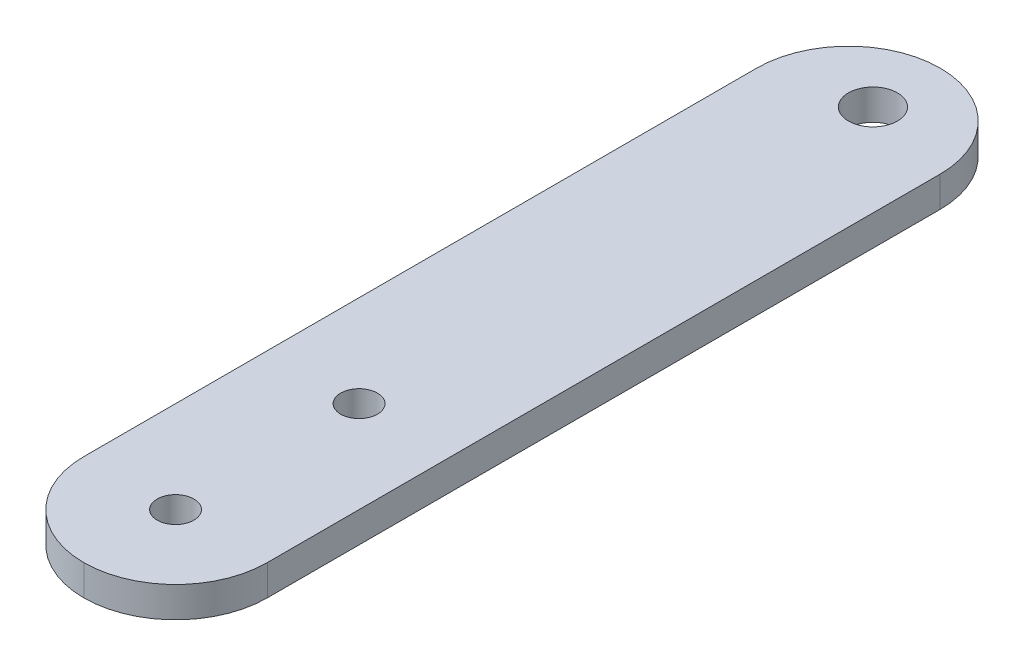
ISO-10303-21;
HEADER;
FILE_DESCRIPTION(('STEP AP214'),'2;1');
FILE_NAME('part.step','',(''),(''),'','','');
FILE_SCHEMA(('AUTOMOTIVE_DESIGN { 1 0 10303 214 1 1 1 1 }'));
ENDSEC;
DATA;
#1=APPLICATION_CONTEXT('core data for automotive mechanical design processes');
#2=APPLICATION_PROTOCOL_DEFINITION('international standard','automotive_design',2000,#1);
#3=PRODUCT_CONTEXT('',#1,'mechanical');
#4=PRODUCT('Part','Part','',(#3));
#5=PRODUCT_RELATED_PRODUCT_CATEGORY('part','',(#4));
#6=PRODUCT_DEFINITION_FORMATION('','',#4);
#7=PRODUCT_DEFINITION_CONTEXT('part definition',#1,'design');
#8=PRODUCT_DEFINITION('design','',#6,#7);
#9=PRODUCT_DEFINITION_SHAPE('','',#8);
#10=(LENGTH_UNIT() NAMED_UNIT(*) SI_UNIT(.MILLI.,.METRE.));
#11=(NAMED_UNIT(*) PLANE_ANGLE_UNIT() SI_UNIT($,.RADIAN.));
#12=(NAMED_UNIT(*) SI_UNIT($,.STERADIAN.) SOLID_ANGLE_UNIT());
#13=UNCERTAINTY_MEASURE_WITH_UNIT(LENGTH_MEASURE(1.E-05),#10,'distance_accuracy_value','');
#14=(GEOMETRIC_REPRESENTATION_CONTEXT(3) GLOBAL_UNCERTAINTY_ASSIGNED_CONTEXT((#13)) GLOBAL_UNIT_ASSIGNED_CONTEXT((#10,
#11,#12)) REPRESENTATION_CONTEXT('',''));
#15=CARTESIAN_POINT('',(0.,0.,0.));
#16=DIRECTION('',(0.,0.,1.));
#17=DIRECTION('',(1.,0.,0.));
#18=AXIS2_PLACEMENT_3D('',#15,#16,#17);
#19=CARTESIAN_POINT('',(7.50000000000001,-1.25,70.));
#20=DIRECTION('',(-1.,0.,0.));
#21=DIRECTION('',(0.,0.,1.));
#22=AXIS2_PLACEMENT_3D('',#19,#20,#21);
#23=PLANE('',#22);
#24=DIRECTION('',(0.,0.,-1.));
#25=VECTOR('',#24,1.);
#26=CARTESIAN_POINT('',(7.50000000000001,-1.25,70.));
#27=LINE('',#26,#25);
#28=CARTESIAN_POINT('',(7.50000000000001,-1.25,62.5));
#29=VERTEX_POINT('',#28);
#30=CARTESIAN_POINT('',(7.50000000000001,-1.25,7.50000000000001));
#31=VERTEX_POINT('',#30);
#32=EDGE_CURVE('E88',#29,#31,#27,.T.);
#33=ORIENTED_EDGE('',*,*,#32,.T.);
#34=DIRECTION('',(0.,1.,0.));
#35=VECTOR('',#34,1.);
#36=CARTESIAN_POINT('',(7.50000000000001,1.25,7.50000000000001));
#37=LINE('',#36,#35);
#38=CARTESIAN_POINT('',(7.50000000000001,1.25,7.50000000000001));
#39=VERTEX_POINT('',#38);
#40=EDGE_CURVE('E95',#31,#39,#37,.T.);
#41=ORIENTED_EDGE('',*,*,#40,.T.);
#42=DIRECTION('',(0.,0.,-1.));
#43=VECTOR('',#42,1.);
#44=CARTESIAN_POINT('',(7.50000000000001,1.25,70.));
#45=LINE('',#44,#43);
#46=CARTESIAN_POINT('',(7.50000000000001,1.25,62.5));
#47=VERTEX_POINT('',#46);
#48=EDGE_CURVE('E91',#47,#39,#45,.T.);
#49=ORIENTED_EDGE('',*,*,#48,.F.);
#50=DIRECTION('',(0.,1.,0.));
#51=VECTOR('',#50,1.);
#52=CARTESIAN_POINT('',(7.50000000000001,-1.25,62.5));
#53=LINE('',#52,#51);
#54=EDGE_CURVE('E85',#47,#29,#53,.F.);
#55=ORIENTED_EDGE('',*,*,#54,.T.);
#56=EDGE_LOOP('',(#33,#41,#49,#55));
#57=FACE_BOUND('',#56,.T.);
#58=ADVANCED_FACE('F30',(#57),#23,.F.);
#59=CARTESIAN_POINT('',(-7.49999999999998,1.25,70.));
#60=DIRECTION('',(0.,-1.,0.));
#61=DIRECTION('',(0.,0.,-1.));
#62=AXIS2_PLACEMENT_3D('',#59,#60,#61);
#63=PLANE('',#62);
#64=CARTESIAN_POINT('',(0.,1.25,47.5));
#65=DIRECTION('',(0.,1.,0.));
#66=DIRECTION('',(0.,0.,1.));
#67=AXIS2_PLACEMENT_3D('',#64,#65,#66);
#68=CIRCLE('',#67,1.5);
#69=CARTESIAN_POINT('',(0.,1.25,49.));
#70=VERTEX_POINT('',#69);
#71=EDGE_CURVE('E143',#70,#70,#68,.T.);
#72=ORIENTED_EDGE('',*,*,#71,.F.);
#73=EDGE_LOOP('',(#72));
#74=FACE_BOUND('',#73,.T.);
#75=CARTESIAN_POINT('',(0.,1.25,5.5));
#76=DIRECTION('',(0.,1.,0.));
#77=DIRECTION('',(0.,0.,1.));
#78=AXIS2_PLACEMENT_3D('',#75,#76,#77);
#79=CIRCLE('',#78,2.);
#80=CARTESIAN_POINT('',(0.,1.25,7.5));
#81=VERTEX_POINT('',#80);
#82=EDGE_CURVE('E137',#81,#81,#79,.T.);
#83=ORIENTED_EDGE('',*,*,#82,.F.);
#84=EDGE_LOOP('',(#83));
#85=FACE_BOUND('',#84,.T.);
#86=CARTESIAN_POINT('',(0.,1.25,62.5));
#87=DIRECTION('',(0.,1.,0.));
#88=DIRECTION('',(0.,0.,1.));
#89=AXIS2_PLACEMENT_3D('',#86,#87,#88);
#90=CIRCLE('',#89,1.5);
#91=CARTESIAN_POINT('',(0.,1.25,64.));
#92=VERTEX_POINT('',#91);
#93=EDGE_CURVE('E151',#92,#92,#90,.T.);
#94=ORIENTED_EDGE('',*,*,#93,.F.);
#95=EDGE_LOOP('',(#94));
#96=FACE_BOUND('',#95,.T.);
#97=ORIENTED_EDGE('',*,*,#48,.T.);
#98=CARTESIAN_POINT('',(0.,1.25,7.50000000000001));
#99=DIRECTION('',(0.,-1.,0.));
#100=DIRECTION('',(0.,0.,-1.));
#101=AXIS2_PLACEMENT_3D('',#98,#99,#100);
#102=CIRCLE('',#101,7.5);
#103=CARTESIAN_POINT('',(0.,1.25,0.));
#104=VERTEX_POINT('',#103);
#105=EDGE_CURVE('E126',#39,#104,#102,.F.);
#106=ORIENTED_EDGE('',*,*,#105,.T.);
#107=CARTESIAN_POINT('',(0.,1.25,7.50000000000001));
#108=DIRECTION('',(0.,-1.,0.));
#109=DIRECTION('',(0.,0.,-1.));
#110=AXIS2_PLACEMENT_3D('',#107,#108,#109);
#111=CIRCLE('',#110,7.5);
#112=CARTESIAN_POINT('',(-7.49999999999998,1.25,7.50000000000001));
#113=VERTEX_POINT('',#112);
#114=EDGE_CURVE('E124',#104,#113,#111,.F.);
#115=ORIENTED_EDGE('',*,*,#114,.T.);
#116=DIRECTION('',(0.,0.,-1.));
#117=VECTOR('',#116,1.);
#118=CARTESIAN_POINT('',(-7.49999999999998,1.25,70.));
#119=LINE('',#118,#117);
#120=CARTESIAN_POINT('',(-7.49999999999998,1.25,62.5));
#121=VERTEX_POINT('',#120);
#122=EDGE_CURVE('E112',#121,#113,#119,.T.);
#123=ORIENTED_EDGE('',*,*,#122,.F.);
#124=CARTESIAN_POINT('',(0.,1.25,62.5));
#125=DIRECTION('',(0.,-1.,0.));
#126=DIRECTION('',(0.,0.,-1.));
#127=AXIS2_PLACEMENT_3D('',#124,#125,#126);
#128=CIRCLE('',#127,7.5);
#129=CARTESIAN_POINT('',(0.,1.25,70.));
#130=VERTEX_POINT('',#129);
#131=EDGE_CURVE('E96',#121,#130,#128,.F.);
#132=ORIENTED_EDGE('',*,*,#131,.T.);
#133=CARTESIAN_POINT('',(0.,1.25,62.5));
#134=DIRECTION('',(0.,-1.,0.));
#135=DIRECTION('',(0.,0.,-1.));
#136=AXIS2_PLACEMENT_3D('',#133,#134,#135);
#137=CIRCLE('',#136,7.5);
#138=EDGE_CURVE('E118',#130,#47,#137,.F.);
#139=ORIENTED_EDGE('',*,*,#138,.T.);
#140=EDGE_LOOP('',(#97,#106,#115,#123,#132,#139));
#141=FACE_BOUND('',#140,.T.);
#142=ADVANCED_FACE('F131',(#74,#85,#96,#141),#63,.F.);
#143=CARTESIAN_POINT('',(-7.49999999999998,-1.25,70.));
#144=DIRECTION('',(1.,0.,0.));
#145=DIRECTION('',(0.,0.,-1.));
#146=AXIS2_PLACEMENT_3D('',#143,#144,#145);
#147=PLANE('',#146);
#148=ORIENTED_EDGE('',*,*,#122,.T.);
#149=DIRECTION('',(0.,-1.,0.));
#150=VECTOR('',#149,1.);
#151=CARTESIAN_POINT('',(-7.49999999999998,-1.25,7.50000000000001));
#152=LINE('',#151,#150);
#153=CARTESIAN_POINT('',(-7.49999999999998,-1.25,7.50000000000001));
#154=VERTEX_POINT('',#153);
#155=EDGE_CURVE('E11',#113,#154,#152,.T.);
#156=ORIENTED_EDGE('',*,*,#155,.T.);
#157=DIRECTION('',(0.,0.,-1.));
#158=VECTOR('',#157,1.);
#159=CARTESIAN_POINT('',(-7.49999999999998,-1.25,70.));
#160=LINE('',#159,#158);
#161=CARTESIAN_POINT('',(-7.49999999999998,-1.25,62.5));
#162=VERTEX_POINT('',#161);
#163=EDGE_CURVE('E102',#162,#154,#160,.T.);
#164=ORIENTED_EDGE('',*,*,#163,.F.);
#165=DIRECTION('',(0.,-1.,0.));
#166=VECTOR('',#165,1.);
#167=CARTESIAN_POINT('',(-7.49999999999998,-1.25,62.5));
#168=LINE('',#167,#166);
#169=EDGE_CURVE('E110',#162,#121,#168,.F.);
#170=ORIENTED_EDGE('',*,*,#169,.T.);
#171=EDGE_LOOP('',(#148,#156,#164,#170));
#172=FACE_BOUND('',#171,.T.);
#173=ADVANCED_FACE('F157',(#172),#147,.F.);
#174=CARTESIAN_POINT('',(-7.49999999999998,-1.25,70.));
#175=DIRECTION('',(0.,1.,0.));
#176=DIRECTION('',(0.,0.,1.));
#177=AXIS2_PLACEMENT_3D('',#174,#175,#176);
#178=PLANE('',#177);
#179=CARTESIAN_POINT('',(0.,-1.25,47.5));
#180=DIRECTION('',(0.,1.,0.));
#181=DIRECTION('',(0.,0.,1.));
#182=AXIS2_PLACEMENT_3D('',#179,#180,#181);
#183=CIRCLE('',#182,1.5);
#184=CARTESIAN_POINT('',(0.,-1.25,49.));
#185=VERTEX_POINT('',#184);
#186=EDGE_CURVE('E138',#185,#185,#183,.T.);
#187=ORIENTED_EDGE('',*,*,#186,.T.);
#188=EDGE_LOOP('',(#187));
#189=FACE_BOUND('',#188,.T.);
#190=CARTESIAN_POINT('',(0.,-1.25,5.5));
#191=DIRECTION('',(0.,1.,0.));
#192=DIRECTION('',(0.,0.,1.));
#193=AXIS2_PLACEMENT_3D('',#190,#191,#192);
#194=CIRCLE('',#193,2.);
#195=CARTESIAN_POINT('',(0.,-1.25,7.5));
#196=VERTEX_POINT('',#195);
#197=EDGE_CURVE('E140',#196,#196,#194,.T.);
#198=ORIENTED_EDGE('',*,*,#197,.T.);
#199=EDGE_LOOP('',(#198));
#200=FACE_BOUND('',#199,.T.);
#201=CARTESIAN_POINT('',(0.,-1.25,62.5));
#202=DIRECTION('',(0.,1.,0.));
#203=DIRECTION('',(0.,0.,1.));
#204=AXIS2_PLACEMENT_3D('',#201,#202,#203);
#205=CIRCLE('',#204,1.5);
#206=CARTESIAN_POINT('',(0.,-1.25,64.));
#207=VERTEX_POINT('',#206);
#208=EDGE_CURVE('E122',#207,#207,#205,.T.);
#209=ORIENTED_EDGE('',*,*,#208,.T.);
#210=EDGE_LOOP('',(#209));
#211=FACE_BOUND('',#210,.T.);
#212=CARTESIAN_POINT('',(0.,-1.25,7.50000000000001));
#213=DIRECTION('',(0.,1.,0.));
#214=DIRECTION('',(0.,0.,1.));
#215=AXIS2_PLACEMENT_3D('',#212,#213,#214);
#216=CIRCLE('',#215,7.5);
#217=CARTESIAN_POINT('',(0.,-1.25,0.));
#218=VERTEX_POINT('',#217);
#219=EDGE_CURVE('E46',#154,#218,#216,.F.);
#220=ORIENTED_EDGE('',*,*,#219,.T.);
#221=CARTESIAN_POINT('',(0.,-1.25,7.50000000000001));
#222=DIRECTION('',(0.,1.,0.));
#223=DIRECTION('',(0.,0.,1.));
#224=AXIS2_PLACEMENT_3D('',#221,#222,#223);
#225=CIRCLE('',#224,7.5);
#226=EDGE_CURVE('E39',#218,#31,#225,.F.);
#227=ORIENTED_EDGE('',*,*,#226,.T.);
#228=ORIENTED_EDGE('',*,*,#32,.F.);
#229=CARTESIAN_POINT('',(0.,-1.25,62.5));
#230=DIRECTION('',(0.,1.,0.));
#231=DIRECTION('',(0.,0.,1.));
#232=AXIS2_PLACEMENT_3D('',#229,#230,#231);
#233=CIRCLE('',#232,7.5);
#234=CARTESIAN_POINT('',(0.,-1.25,70.));
#235=VERTEX_POINT('',#234);
#236=EDGE_CURVE('E99',#29,#235,#233,.F.);
#237=ORIENTED_EDGE('',*,*,#236,.T.);
#238=CARTESIAN_POINT('',(0.,-1.25,62.5));
#239=DIRECTION('',(0.,1.,0.));
#240=DIRECTION('',(0.,0.,1.));
#241=AXIS2_PLACEMENT_3D('',#238,#239,#240);
#242=CIRCLE('',#241,7.5);
#243=EDGE_CURVE('E108',#235,#162,#242,.F.);
#244=ORIENTED_EDGE('',*,*,#243,.T.);
#245=ORIENTED_EDGE('',*,*,#163,.T.);
#246=EDGE_LOOP('',(#220,#227,#228,#237,#244,#245));
#247=FACE_BOUND('',#246,.T.);
#248=ADVANCED_FACE('F98',(#189,#200,#211,#247),#178,.F.);
#249=CARTESIAN_POINT('',(0.,1.25,62.5));
#250=DIRECTION('',(0.,1.,0.));
#251=DIRECTION('',(0.,0.,1.));
#252=AXIS2_PLACEMENT_3D('',#249,#250,#251);
#253=CYLINDRICAL_SURFACE('',#252,7.5);
#254=ORIENTED_EDGE('',*,*,#54,.F.);
#255=ORIENTED_EDGE('',*,*,#138,.F.);
#256=DIRECTION('',(0.,1.,0.));
#257=VECTOR('',#256,1.);
#258=CARTESIAN_POINT('',(0.,1.25,70.));
#259=LINE('',#258,#257);
#260=EDGE_CURVE('E103',#235,#130,#259,.T.);
#261=ORIENTED_EDGE('',*,*,#260,.F.);
#262=ORIENTED_EDGE('',*,*,#236,.F.);
#263=EDGE_LOOP('',(#254,#255,#261,#262));
#264=FACE_BOUND('',#263,.T.);
#265=ADVANCED_FACE('F105',(#264),#253,.T.);
#266=CARTESIAN_POINT('',(0.,1.25,62.5));
#267=DIRECTION('',(0.,-1.,0.));
#268=DIRECTION('',(0.,0.,-1.));
#269=AXIS2_PLACEMENT_3D('',#266,#267,#268);
#270=CYLINDRICAL_SURFACE('',#269,7.5);
#271=ORIENTED_EDGE('',*,*,#131,.F.);
#272=ORIENTED_EDGE('',*,*,#169,.F.);
#273=ORIENTED_EDGE('',*,*,#243,.F.);
#274=ORIENTED_EDGE('',*,*,#260,.T.);
#275=EDGE_LOOP('',(#271,#272,#273,#274));
#276=FACE_BOUND('',#275,.T.);
#277=ADVANCED_FACE('F160',(#276),#270,.T.);
#278=CARTESIAN_POINT('',(0.,-1.25,62.5));
#279=DIRECTION('',(0.,1.,0.));
#280=DIRECTION('',(0.,0.,1.));
#281=AXIS2_PLACEMENT_3D('',#278,#279,#280);
#282=CYLINDRICAL_SURFACE('',#281,1.5);
#283=ORIENTED_EDGE('',*,*,#208,.F.);
#284=EDGE_LOOP('',(#283));
#285=FACE_BOUND('',#284,.T.);
#286=ORIENTED_EDGE('',*,*,#93,.T.);
#287=EDGE_LOOP('',(#286));
#288=FACE_BOUND('',#287,.T.);
#289=ADVANCED_FACE('F162',(#285,#288),#282,.F.);
#290=CARTESIAN_POINT('',(0.,-1.25,5.5));
#291=DIRECTION('',(0.,1.,0.));
#292=DIRECTION('',(0.,0.,1.));
#293=AXIS2_PLACEMENT_3D('',#290,#291,#292);
#294=CYLINDRICAL_SURFACE('',#293,2.);
#295=ORIENTED_EDGE('',*,*,#197,.F.);
#296=EDGE_LOOP('',(#295));
#297=FACE_BOUND('',#296,.T.);
#298=ORIENTED_EDGE('',*,*,#82,.T.);
#299=EDGE_LOOP('',(#298));
#300=FACE_BOUND('',#299,.T.);
#301=ADVANCED_FACE('F168',(#297,#300),#294,.F.);
#302=CARTESIAN_POINT('',(0.,-1.25,7.50000000000001));
#303=DIRECTION('',(0.,1.,0.));
#304=DIRECTION('',(0.,0.,1.));
#305=AXIS2_PLACEMENT_3D('',#302,#303,#304);
#306=CYLINDRICAL_SURFACE('',#305,7.5);
#307=DIRECTION('',(0.,-1.,0.));
#308=VECTOR('',#307,1.);
#309=CARTESIAN_POINT('',(0.,1.25,0.));
#310=LINE('',#309,#308);
#311=EDGE_CURVE('E34',#218,#104,#310,.F.);
#312=ORIENTED_EDGE('',*,*,#311,.F.);
#313=ORIENTED_EDGE('',*,*,#219,.F.);
#314=ORIENTED_EDGE('',*,*,#155,.F.);
#315=ORIENTED_EDGE('',*,*,#114,.F.);
#316=EDGE_LOOP('',(#312,#313,#314,#315));
#317=FACE_BOUND('',#316,.T.);
#318=ADVANCED_FACE('F32',(#317),#306,.T.);
#319=CARTESIAN_POINT('',(0.,-1.25,7.50000000000001));
#320=DIRECTION('',(0.,-1.,0.));
#321=DIRECTION('',(0.,0.,-1.));
#322=AXIS2_PLACEMENT_3D('',#319,#320,#321);
#323=CYLINDRICAL_SURFACE('',#322,7.5);
#324=ORIENTED_EDGE('',*,*,#226,.F.);
#325=ORIENTED_EDGE('',*,*,#311,.T.);
#326=ORIENTED_EDGE('',*,*,#105,.F.);
#327=ORIENTED_EDGE('',*,*,#40,.F.);
#328=EDGE_LOOP('',(#324,#325,#326,#327));
#329=FACE_BOUND('',#328,.T.);
#330=ADVANCED_FACE('F136',(#329),#323,.T.);
#331=CARTESIAN_POINT('',(0.,-1.25,47.5));
#332=DIRECTION('',(0.,1.,0.));
#333=DIRECTION('',(0.,0.,1.));
#334=AXIS2_PLACEMENT_3D('',#331,#332,#333);
#335=CYLINDRICAL_SURFACE('',#334,1.5);
#336=ORIENTED_EDGE('',*,*,#186,.F.);
#337=EDGE_LOOP('',(#336));
#338=FACE_BOUND('',#337,.T.);
#339=ORIENTED_EDGE('',*,*,#71,.T.);
#340=EDGE_LOOP('',(#339));
#341=FACE_BOUND('',#340,.T.);
#342=ADVANCED_FACE('F187',(#338,#341),#335,.F.);
#343=CLOSED_SHELL('',(#58,#142,#173,#248,#265,#277,#289,#301,#318,#330,#342));
#344=MANIFOLD_SOLID_BREP('B2',#343);
#345=ADVANCED_BREP_SHAPE_REPRESENTATION('',(#18,#344),#14);
#346=SHAPE_DEFINITION_REPRESENTATION(#9,#345);
ENDSEC;
END-ISO-10303-21;
